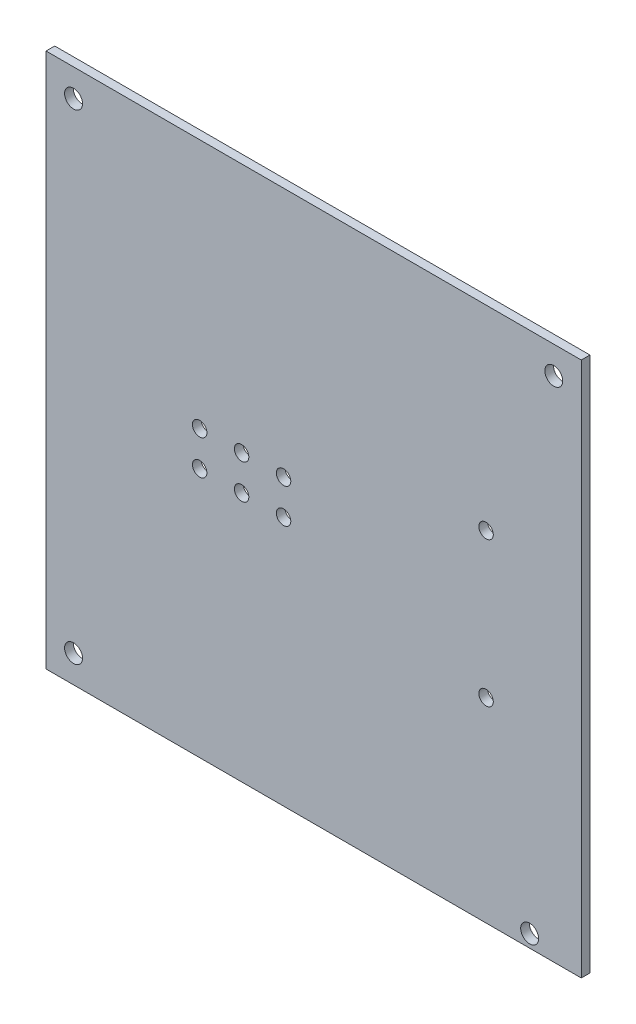
ISO-10303-21;
HEADER;
FILE_DESCRIPTION(('STEP AP214'),'2;1');
FILE_NAME('part.step','',(''),(''),'','','');
FILE_SCHEMA(('AUTOMOTIVE_DESIGN { 1 0 10303 214 1 1 1 1 }'));
ENDSEC;
DATA;
#1=APPLICATION_CONTEXT('core data for automotive mechanical design processes');
#2=APPLICATION_PROTOCOL_DEFINITION('international standard','automotive_design',2000,#1);
#3=PRODUCT_CONTEXT('',#1,'mechanical');
#4=PRODUCT('Part','Part','',(#3));
#5=PRODUCT_RELATED_PRODUCT_CATEGORY('part','',(#4));
#6=PRODUCT_DEFINITION_FORMATION('','',#4);
#7=PRODUCT_DEFINITION_CONTEXT('part definition',#1,'design');
#8=PRODUCT_DEFINITION('design','',#6,#7);
#9=PRODUCT_DEFINITION_SHAPE('','',#8);
#10=(LENGTH_UNIT() NAMED_UNIT(*) SI_UNIT(.MILLI.,.METRE.));
#11=(NAMED_UNIT(*) PLANE_ANGLE_UNIT() SI_UNIT($,.RADIAN.));
#12=(NAMED_UNIT(*) SI_UNIT($,.STERADIAN.) SOLID_ANGLE_UNIT());
#13=UNCERTAINTY_MEASURE_WITH_UNIT(LENGTH_MEASURE(1.E-05),#10,'distance_accuracy_value','');
#14=(GEOMETRIC_REPRESENTATION_CONTEXT(3) GLOBAL_UNCERTAINTY_ASSIGNED_CONTEXT((#13)) GLOBAL_UNIT_ASSIGNED_CONTEXT((#10,
#11,#12)) REPRESENTATION_CONTEXT('',''));
#15=CARTESIAN_POINT('',(0.,0.,0.));
#16=DIRECTION('',(0.,0.,1.));
#17=DIRECTION('',(1.,0.,0.));
#18=AXIS2_PLACEMENT_3D('',#15,#16,#17);
#19=CARTESIAN_POINT('',(-46.25,-46.25,1.5));
#20=DIRECTION('',(1.,0.,0.));
#21=DIRECTION('',(0.,0.,-1.));
#22=AXIS2_PLACEMENT_3D('',#19,#20,#21);
#23=PLANE('',#22);
#24=DIRECTION('',(0.,-1.,0.));
#25=VECTOR('',#24,1.);
#26=CARTESIAN_POINT('',(-46.25,-46.25,0.));
#27=LINE('',#26,#25);
#28=CARTESIAN_POINT('',(-46.25,46.25,0.));
#29=VERTEX_POINT('',#28);
#30=CARTESIAN_POINT('',(-46.25,-46.25,0.));
#31=VERTEX_POINT('',#30);
#32=EDGE_CURVE('E104',#29,#31,#27,.T.);
#33=ORIENTED_EDGE('',*,*,#32,.T.);
#34=DIRECTION('',(0.,0.,-1.));
#35=VECTOR('',#34,1.);
#36=CARTESIAN_POINT('',(-46.25,-46.25,1.5));
#37=LINE('',#36,#35);
#38=CARTESIAN_POINT('',(-46.25,-46.25,1.5));
#39=VERTEX_POINT('',#38);
#40=EDGE_CURVE('E11',#39,#31,#37,.T.);
#41=ORIENTED_EDGE('',*,*,#40,.F.);
#42=DIRECTION('',(0.,-1.,0.));
#43=VECTOR('',#42,1.);
#44=CARTESIAN_POINT('',(-46.25,-46.25,1.5));
#45=LINE('',#44,#43);
#46=CARTESIAN_POINT('',(-46.25,46.25,1.5));
#47=VERTEX_POINT('',#46);
#48=EDGE_CURVE('E92',#47,#39,#45,.T.);
#49=ORIENTED_EDGE('',*,*,#48,.F.);
#50=DIRECTION('',(0.,0.,-1.));
#51=VECTOR('',#50,1.);
#52=CARTESIAN_POINT('',(-46.25,46.25,1.5));
#53=LINE('',#52,#51);
#54=EDGE_CURVE('E100',#47,#29,#53,.T.);
#55=ORIENTED_EDGE('',*,*,#54,.T.);
#56=EDGE_LOOP('',(#33,#41,#49,#55));
#57=FACE_BOUND('',#56,.T.);
#58=ADVANCED_FACE('F41',(#57),#23,.F.);
#59=CARTESIAN_POINT('',(46.25,-46.25,1.5));
#60=DIRECTION('',(0.,1.,0.));
#61=DIRECTION('',(-1.,0.,0.));
#62=AXIS2_PLACEMENT_3D('',#59,#60,#61);
#63=PLANE('',#62);
#64=DIRECTION('',(1.,0.,0.));
#65=VECTOR('',#64,1.);
#66=CARTESIAN_POINT('',(46.25,-46.25,0.));
#67=LINE('',#66,#65);
#68=CARTESIAN_POINT('',(46.25,-46.25,0.));
#69=VERTEX_POINT('',#68);
#70=EDGE_CURVE('E96',#31,#69,#67,.T.);
#71=ORIENTED_EDGE('',*,*,#70,.T.);
#72=DIRECTION('',(0.,0.,-1.));
#73=VECTOR('',#72,1.);
#74=CARTESIAN_POINT('',(46.25,-46.25,1.5));
#75=LINE('',#74,#73);
#76=CARTESIAN_POINT('',(46.25,-46.25,1.5));
#77=VERTEX_POINT('',#76);
#78=EDGE_CURVE('E49',#77,#69,#75,.T.);
#79=ORIENTED_EDGE('',*,*,#78,.F.);
#80=DIRECTION('',(1.,0.,0.));
#81=VECTOR('',#80,1.);
#82=CARTESIAN_POINT('',(46.25,-46.25,1.5));
#83=LINE('',#82,#81);
#84=EDGE_CURVE('E87',#39,#77,#83,.T.);
#85=ORIENTED_EDGE('',*,*,#84,.F.);
#86=ORIENTED_EDGE('',*,*,#40,.T.);
#87=EDGE_LOOP('',(#71,#79,#85,#86));
#88=FACE_BOUND('',#87,.T.);
#89=ADVANCED_FACE('F95',(#88),#63,.F.);
#90=CARTESIAN_POINT('',(46.25,-46.25,1.5));
#91=DIRECTION('',(-1.,0.,0.));
#92=DIRECTION('',(0.,0.,1.));
#93=AXIS2_PLACEMENT_3D('',#90,#91,#92);
#94=PLANE('',#93);
#95=DIRECTION('',(0.,1.,0.));
#96=VECTOR('',#95,1.);
#97=CARTESIAN_POINT('',(46.25,-46.25,0.));
#98=LINE('',#97,#96);
#99=CARTESIAN_POINT('',(46.25,46.25,0.));
#100=VERTEX_POINT('',#99);
#101=EDGE_CURVE('E74',#69,#100,#98,.T.);
#102=ORIENTED_EDGE('',*,*,#101,.T.);
#103=DIRECTION('',(0.,0.,-1.));
#104=VECTOR('',#103,1.);
#105=CARTESIAN_POINT('',(46.25,46.25,1.5));
#106=LINE('',#105,#104);
#107=CARTESIAN_POINT('',(46.25,46.25,1.5));
#108=VERTEX_POINT('',#107);
#109=EDGE_CURVE('E97',#108,#100,#106,.T.);
#110=ORIENTED_EDGE('',*,*,#109,.F.);
#111=DIRECTION('',(0.,1.,0.));
#112=VECTOR('',#111,1.);
#113=CARTESIAN_POINT('',(46.25,-46.25,1.5));
#114=LINE('',#113,#112);
#115=EDGE_CURVE('E90',#77,#108,#114,.T.);
#116=ORIENTED_EDGE('',*,*,#115,.F.);
#117=ORIENTED_EDGE('',*,*,#78,.T.);
#118=EDGE_LOOP('',(#102,#110,#116,#117));
#119=FACE_BOUND('',#118,.T.);
#120=ADVANCED_FACE('F98',(#119),#94,.F.);
#121=CARTESIAN_POINT('',(46.25,46.25,1.5));
#122=DIRECTION('',(0.,-1.,0.));
#123=DIRECTION('',(1.,0.,0.));
#124=AXIS2_PLACEMENT_3D('',#121,#122,#123);
#125=PLANE('',#124);
#126=DIRECTION('',(-1.,0.,0.));
#127=VECTOR('',#126,1.);
#128=CARTESIAN_POINT('',(46.25,46.25,0.));
#129=LINE('',#128,#127);
#130=EDGE_CURVE('E80',#100,#29,#129,.T.);
#131=ORIENTED_EDGE('',*,*,#130,.T.);
#132=ORIENTED_EDGE('',*,*,#54,.F.);
#133=DIRECTION('',(-1.,0.,0.));
#134=VECTOR('',#133,1.);
#135=CARTESIAN_POINT('',(46.25,46.25,1.5));
#136=LINE('',#135,#134);
#137=EDGE_CURVE('E57',#108,#47,#136,.T.);
#138=ORIENTED_EDGE('',*,*,#137,.F.);
#139=ORIENTED_EDGE('',*,*,#109,.T.);
#140=EDGE_LOOP('',(#131,#132,#138,#139));
#141=FACE_BOUND('',#140,.T.);
#142=ADVANCED_FACE('F112',(#141),#125,.F.);
#143=CARTESIAN_POINT('',(0.,0.,1.5));
#144=DIRECTION('',(0.,0.,1.));
#145=DIRECTION('',(1.,0.,0.));
#146=AXIS2_PLACEMENT_3D('',#143,#144,#145);
#147=PLANE('',#146);
#148=CARTESIAN_POINT('',(-19.7049759550091,3.00000000013522,1.5));
#149=DIRECTION('',(0.,0.,-1.));
#150=DIRECTION('',(-1.,0.,0.));
#151=AXIS2_PLACEMENT_3D('',#148,#149,#150);
#152=CIRCLE('',#151,1.25);
#153=CARTESIAN_POINT('',(-20.9549759550091,3.00000000013522,1.5));
#154=VERTEX_POINT('',#153);
#155=EDGE_CURVE('E183',#154,#154,#152,.T.);
#156=ORIENTED_EDGE('',*,*,#155,.T.);
#157=EDGE_LOOP('',(#156));
#158=FACE_BOUND('',#157,.T.);
#159=CARTESIAN_POINT('',(-19.7049759550134,-2.99999999986479,1.5));
#160=DIRECTION('',(0.,0.,-1.));
#161=DIRECTION('',(-1.,0.,0.));
#162=AXIS2_PLACEMENT_3D('',#159,#160,#161);
#163=CIRCLE('',#162,1.25);
#164=CARTESIAN_POINT('',(-20.9549759550134,-2.99999999986479,1.5));
#165=VERTEX_POINT('',#164);
#166=EDGE_CURVE('E177',#165,#165,#163,.T.);
#167=ORIENTED_EDGE('',*,*,#166,.T.);
#168=EDGE_LOOP('',(#167));
#169=FACE_BOUND('',#168,.T.);
#170=CARTESIAN_POINT('',(-12.4549759550134,-2.99999999987001,1.5));
#171=DIRECTION('',(0.,0.,-1.));
#172=DIRECTION('',(-1.,0.,0.));
#173=AXIS2_PLACEMENT_3D('',#170,#171,#172);
#174=CIRCLE('',#173,1.25);
#175=CARTESIAN_POINT('',(-13.7049759550134,-2.99999999987001,1.5));
#176=VERTEX_POINT('',#175);
#177=EDGE_CURVE('E171',#176,#176,#174,.T.);
#178=ORIENTED_EDGE('',*,*,#177,.T.);
#179=EDGE_LOOP('',(#178));
#180=FACE_BOUND('',#179,.T.);
#181=CARTESIAN_POINT('',(-12.4549759550091,3.00000000013,1.5));
#182=DIRECTION('',(0.,0.,-1.));
#183=DIRECTION('',(-1.,0.,0.));
#184=AXIS2_PLACEMENT_3D('',#181,#182,#183);
#185=CIRCLE('',#184,1.25);
#186=CARTESIAN_POINT('',(-13.7049759550091,3.00000000013,1.5));
#187=VERTEX_POINT('',#186);
#188=EDGE_CURVE('E165',#187,#187,#185,.T.);
#189=ORIENTED_EDGE('',*,*,#188,.T.);
#190=EDGE_LOOP('',(#189));
#191=FACE_BOUND('',#190,.T.);
#192=CARTESIAN_POINT('',(-5.20497595500907,3.00000000012478,1.5));
#193=DIRECTION('',(0.,0.,-1.));
#194=DIRECTION('',(-1.,0.,0.));
#195=AXIS2_PLACEMENT_3D('',#192,#193,#194);
#196=CIRCLE('',#195,1.25);
#197=CARTESIAN_POINT('',(-6.45497595500907,3.00000000012478,1.5));
#198=VERTEX_POINT('',#197);
#199=EDGE_CURVE('E159',#198,#198,#196,.T.);
#200=ORIENTED_EDGE('',*,*,#199,.T.);
#201=EDGE_LOOP('',(#200));
#202=FACE_BOUND('',#201,.T.);
#203=CARTESIAN_POINT('',(-5.2049759550134,-2.99999999987523,1.5));
#204=DIRECTION('',(0.,0.,-1.));
#205=DIRECTION('',(-1.,0.,0.));
#206=AXIS2_PLACEMENT_3D('',#203,#204,#205);
#207=CIRCLE('',#206,1.25);
#208=CARTESIAN_POINT('',(-6.4549759550134,-2.99999999987523,1.5));
#209=VERTEX_POINT('',#208);
#210=EDGE_CURVE('E153',#209,#209,#207,.T.);
#211=ORIENTED_EDGE('',*,*,#210,.T.);
#212=EDGE_LOOP('',(#211));
#213=FACE_BOUND('',#212,.T.);
#214=CARTESIAN_POINT('',(29.795024044932,12.5020147484995,1.5));
#215=DIRECTION('',(0.,0.,-1.));
#216=DIRECTION('',(-1.,0.,0.));
#217=AXIS2_PLACEMENT_3D('',#214,#215,#216);
#218=CIRCLE('',#217,1.25);
#219=CARTESIAN_POINT('',(28.545024044932,12.5020147484995,1.5));
#220=VERTEX_POINT('',#219);
#221=EDGE_CURVE('E147',#220,#220,#218,.T.);
#222=ORIENTED_EDGE('',*,*,#221,.T.);
#223=EDGE_LOOP('',(#222));
#224=FACE_BOUND('',#223,.T.);
#225=CARTESIAN_POINT('',(29.795024044914,-12.50177791102,1.5));
#226=DIRECTION('',(0.,0.,-1.));
#227=DIRECTION('',(-1.,0.,0.));
#228=AXIS2_PLACEMENT_3D('',#225,#226,#227);
#229=CIRCLE('',#228,1.25);
#230=CARTESIAN_POINT('',(28.545024044914,-12.50177791102,1.5));
#231=VERTEX_POINT('',#230);
#232=EDGE_CURVE('E141',#231,#231,#229,.T.);
#233=ORIENTED_EDGE('',*,*,#232,.T.);
#234=EDGE_LOOP('',(#233));
#235=FACE_BOUND('',#234,.T.);
#236=CARTESIAN_POINT('',(-41.4999999999924,41.500000000232,1.5));
#237=DIRECTION('',(0.,0.,1.));
#238=DIRECTION('',(1.,0.,0.));
#239=AXIS2_PLACEMENT_3D('',#236,#237,#238);
#240=CIRCLE('',#239,1.54999999999999);
#241=CARTESIAN_POINT('',(-39.9499999999924,41.500000000232,1.5));
#242=VERTEX_POINT('',#241);
#243=EDGE_CURVE('E138',#242,#242,#240,.T.);
#244=ORIENTED_EDGE('',*,*,#243,.F.);
#245=EDGE_LOOP('',(#244));
#246=FACE_BOUND('',#245,.T.);
#247=CARTESIAN_POINT('',(41.5000000000076,41.5000000001722,1.5));
#248=DIRECTION('',(0.,0.,1.));
#249=DIRECTION('',(1.,0.,0.));
#250=AXIS2_PLACEMENT_3D('',#247,#248,#249);
#251=CIRCLE('',#250,1.54999999999999);
#252=CARTESIAN_POINT('',(43.0500000000076,41.5000000001722,1.5));
#253=VERTEX_POINT('',#252);
#254=EDGE_CURVE('E132',#253,#253,#251,.T.);
#255=ORIENTED_EDGE('',*,*,#254,.F.);
#256=EDGE_LOOP('',(#255));
#257=FACE_BOUND('',#256,.T.);
#258=CARTESIAN_POINT('',(37.3299999999459,-44.0499999998248,1.5));
#259=DIRECTION('',(0.,0.,1.));
#260=DIRECTION('',(1.,0.,0.));
#261=AXIS2_PLACEMENT_3D('',#258,#259,#260);
#262=CIRCLE('',#261,1.54999999999999);
#263=CARTESIAN_POINT('',(38.8799999999459,-44.0499999998248,1.5));
#264=VERTEX_POINT('',#263);
#265=EDGE_CURVE('E126',#264,#264,#262,.T.);
#266=ORIENTED_EDGE('',*,*,#265,.F.);
#267=EDGE_LOOP('',(#266));
#268=FACE_BOUND('',#267,.T.);
#269=CARTESIAN_POINT('',(-41.5000000000522,-41.499999999768,1.5));
#270=DIRECTION('',(0.,0.,1.));
#271=DIRECTION('',(1.,0.,0.));
#272=AXIS2_PLACEMENT_3D('',#269,#270,#271);
#273=CIRCLE('',#272,1.54999999999999);
#274=CARTESIAN_POINT('',(-39.9500000000523,-41.499999999768,1.5));
#275=VERTEX_POINT('',#274);
#276=EDGE_CURVE('E120',#275,#275,#273,.T.);
#277=ORIENTED_EDGE('',*,*,#276,.F.);
#278=EDGE_LOOP('',(#277));
#279=FACE_BOUND('',#278,.T.);
#280=ORIENTED_EDGE('',*,*,#48,.T.);
#281=ORIENTED_EDGE('',*,*,#84,.T.);
#282=ORIENTED_EDGE('',*,*,#115,.T.);
#283=ORIENTED_EDGE('',*,*,#137,.T.);
#284=EDGE_LOOP('',(#280,#281,#282,#283));
#285=FACE_BOUND('',#284,.T.);
#286=ADVANCED_FACE('F88',(#158,#169,#180,#191,#202,#213,#224,#235,#246,#257,#268,#279,#285),
#147,.T.);
#287=CARTESIAN_POINT('',(0.,0.,0.));
#288=DIRECTION('',(0.,0.,1.));
#289=DIRECTION('',(1.,0.,0.));
#290=AXIS2_PLACEMENT_3D('',#287,#288,#289);
#291=PLANE('',#290);
#292=CARTESIAN_POINT('',(-19.7049759550091,3.00000000013522,0.));
#293=DIRECTION('',(0.,0.,-1.));
#294=DIRECTION('',(-1.,0.,0.));
#295=AXIS2_PLACEMENT_3D('',#292,#293,#294);
#296=CIRCLE('',#295,1.24999999999999);
#297=CARTESIAN_POINT('',(-20.9549759550091,3.00000000013522,0.));
#298=VERTEX_POINT('',#297);
#299=EDGE_CURVE('E186',#298,#298,#296,.T.);
#300=ORIENTED_EDGE('',*,*,#299,.F.);
#301=EDGE_LOOP('',(#300));
#302=FACE_BOUND('',#301,.T.);
#303=CARTESIAN_POINT('',(-19.7049759550134,-2.99999999986479,0.));
#304=DIRECTION('',(0.,0.,-1.));
#305=DIRECTION('',(-1.,0.,0.));
#306=AXIS2_PLACEMENT_3D('',#303,#304,#305);
#307=CIRCLE('',#306,1.24999999999999);
#308=CARTESIAN_POINT('',(-20.9549759550134,-2.99999999986479,0.));
#309=VERTEX_POINT('',#308);
#310=EDGE_CURVE('E180',#309,#309,#307,.T.);
#311=ORIENTED_EDGE('',*,*,#310,.F.);
#312=EDGE_LOOP('',(#311));
#313=FACE_BOUND('',#312,.T.);
#314=CARTESIAN_POINT('',(-12.4549759550134,-2.99999999987001,0.));
#315=DIRECTION('',(0.,0.,-1.));
#316=DIRECTION('',(-1.,0.,0.));
#317=AXIS2_PLACEMENT_3D('',#314,#315,#316);
#318=CIRCLE('',#317,1.24999999999999);
#319=CARTESIAN_POINT('',(-13.7049759550134,-2.99999999987001,0.));
#320=VERTEX_POINT('',#319);
#321=EDGE_CURVE('E174',#320,#320,#318,.T.);
#322=ORIENTED_EDGE('',*,*,#321,.F.);
#323=EDGE_LOOP('',(#322));
#324=FACE_BOUND('',#323,.T.);
#325=CARTESIAN_POINT('',(-12.4549759550091,3.00000000013,0.));
#326=DIRECTION('',(0.,0.,-1.));
#327=DIRECTION('',(-1.,0.,0.));
#328=AXIS2_PLACEMENT_3D('',#325,#326,#327);
#329=CIRCLE('',#328,1.24999999999999);
#330=CARTESIAN_POINT('',(-13.7049759550091,3.00000000013,0.));
#331=VERTEX_POINT('',#330);
#332=EDGE_CURVE('E168',#331,#331,#329,.T.);
#333=ORIENTED_EDGE('',*,*,#332,.F.);
#334=EDGE_LOOP('',(#333));
#335=FACE_BOUND('',#334,.T.);
#336=CARTESIAN_POINT('',(-5.20497595500907,3.00000000012478,0.));
#337=DIRECTION('',(0.,0.,-1.));
#338=DIRECTION('',(-1.,0.,0.));
#339=AXIS2_PLACEMENT_3D('',#336,#337,#338);
#340=CIRCLE('',#339,1.24999999999999);
#341=CARTESIAN_POINT('',(-6.45497595500906,3.00000000012478,0.));
#342=VERTEX_POINT('',#341);
#343=EDGE_CURVE('E162',#342,#342,#340,.T.);
#344=ORIENTED_EDGE('',*,*,#343,.F.);
#345=EDGE_LOOP('',(#344));
#346=FACE_BOUND('',#345,.T.);
#347=CARTESIAN_POINT('',(-5.2049759550134,-2.99999999987523,0.));
#348=DIRECTION('',(0.,0.,-1.));
#349=DIRECTION('',(-1.,0.,0.));
#350=AXIS2_PLACEMENT_3D('',#347,#348,#349);
#351=CIRCLE('',#350,1.24999999999999);
#352=CARTESIAN_POINT('',(-6.45497595501339,-2.99999999987523,0.));
#353=VERTEX_POINT('',#352);
#354=EDGE_CURVE('E156',#353,#353,#351,.T.);
#355=ORIENTED_EDGE('',*,*,#354,.F.);
#356=EDGE_LOOP('',(#355));
#357=FACE_BOUND('',#356,.T.);
#358=CARTESIAN_POINT('',(29.795024044932,12.5020147484995,0.));
#359=DIRECTION('',(0.,0.,-1.));
#360=DIRECTION('',(-1.,0.,0.));
#361=AXIS2_PLACEMENT_3D('',#358,#359,#360);
#362=CIRCLE('',#361,1.24999999999999);
#363=CARTESIAN_POINT('',(28.545024044932,12.5020147484995,0.));
#364=VERTEX_POINT('',#363);
#365=EDGE_CURVE('E150',#364,#364,#362,.T.);
#366=ORIENTED_EDGE('',*,*,#365,.F.);
#367=EDGE_LOOP('',(#366));
#368=FACE_BOUND('',#367,.T.);
#369=CARTESIAN_POINT('',(29.795024044914,-12.50177791102,0.));
#370=DIRECTION('',(0.,0.,-1.));
#371=DIRECTION('',(-1.,0.,0.));
#372=AXIS2_PLACEMENT_3D('',#369,#370,#371);
#373=CIRCLE('',#372,1.24999999999999);
#374=CARTESIAN_POINT('',(28.545024044914,-12.50177791102,0.));
#375=VERTEX_POINT('',#374);
#376=EDGE_CURVE('E144',#375,#375,#373,.T.);
#377=ORIENTED_EDGE('',*,*,#376,.F.);
#378=EDGE_LOOP('',(#377));
#379=FACE_BOUND('',#378,.T.);
#380=CARTESIAN_POINT('',(-41.4999999999924,41.500000000232,0.));
#381=DIRECTION('',(0.,0.,1.));
#382=DIRECTION('',(1.,0.,0.));
#383=AXIS2_PLACEMENT_3D('',#380,#381,#382);
#384=CIRCLE('',#383,1.55);
#385=CARTESIAN_POINT('',(-39.9499999999924,41.500000000232,0.));
#386=VERTEX_POINT('',#385);
#387=EDGE_CURVE('E135',#386,#386,#384,.T.);
#388=ORIENTED_EDGE('',*,*,#387,.T.);
#389=EDGE_LOOP('',(#388));
#390=FACE_BOUND('',#389,.T.);
#391=CARTESIAN_POINT('',(41.5000000000076,41.5000000001722,0.));
#392=DIRECTION('',(0.,0.,1.));
#393=DIRECTION('',(1.,0.,0.));
#394=AXIS2_PLACEMENT_3D('',#391,#392,#393);
#395=CIRCLE('',#394,1.55);
#396=CARTESIAN_POINT('',(43.0500000000076,41.5000000001722,0.));
#397=VERTEX_POINT('',#396);
#398=EDGE_CURVE('E129',#397,#397,#395,.T.);
#399=ORIENTED_EDGE('',*,*,#398,.T.);
#400=EDGE_LOOP('',(#399));
#401=FACE_BOUND('',#400,.T.);
#402=CARTESIAN_POINT('',(37.3299999999459,-44.0499999998248,0.));
#403=DIRECTION('',(0.,0.,1.));
#404=DIRECTION('',(1.,0.,0.));
#405=AXIS2_PLACEMENT_3D('',#402,#403,#404);
#406=CIRCLE('',#405,1.55);
#407=CARTESIAN_POINT('',(38.8799999999459,-44.0499999998248,0.));
#408=VERTEX_POINT('',#407);
#409=EDGE_CURVE('E123',#408,#408,#406,.T.);
#410=ORIENTED_EDGE('',*,*,#409,.T.);
#411=EDGE_LOOP('',(#410));
#412=FACE_BOUND('',#411,.T.);
#413=CARTESIAN_POINT('',(-41.5000000000522,-41.499999999768,0.));
#414=DIRECTION('',(0.,0.,1.));
#415=DIRECTION('',(1.,0.,0.));
#416=AXIS2_PLACEMENT_3D('',#413,#414,#415);
#417=CIRCLE('',#416,1.55);
#418=CARTESIAN_POINT('',(-39.9500000000522,-41.499999999768,0.));
#419=VERTEX_POINT('',#418);
#420=EDGE_CURVE('E107',#419,#419,#417,.T.);
#421=ORIENTED_EDGE('',*,*,#420,.T.);
#422=EDGE_LOOP('',(#421));
#423=FACE_BOUND('',#422,.T.);
#424=ORIENTED_EDGE('',*,*,#32,.F.);
#425=ORIENTED_EDGE('',*,*,#130,.F.);
#426=ORIENTED_EDGE('',*,*,#101,.F.);
#427=ORIENTED_EDGE('',*,*,#70,.F.);
#428=EDGE_LOOP('',(#424,#425,#426,#427));
#429=FACE_BOUND('',#428,.T.);
#430=ADVANCED_FACE('F115',(#302,#313,#324,#335,#346,#357,#368,#379,#390,#401,#412,#423,#429),
#291,.F.);
#431=CARTESIAN_POINT('',(-41.5000000000522,-41.499999999768,1.5));
#432=DIRECTION('',(0.,0.,1.));
#433=DIRECTION('',(1.,0.,0.));
#434=AXIS2_PLACEMENT_3D('',#431,#432,#433);
#435=CYLINDRICAL_SURFACE('',#434,1.54999999999999);
#436=ORIENTED_EDGE('',*,*,#420,.F.);
#437=EDGE_LOOP('',(#436));
#438=FACE_BOUND('',#437,.T.);
#439=ORIENTED_EDGE('',*,*,#276,.T.);
#440=EDGE_LOOP('',(#439));
#441=FACE_BOUND('',#440,.T.);
#442=ADVANCED_FACE('F194',(#438,#441),#435,.F.);
#443=CARTESIAN_POINT('',(37.3299999999459,-44.0499999998248,1.5));
#444=DIRECTION('',(0.,0.,1.));
#445=DIRECTION('',(1.,0.,0.));
#446=AXIS2_PLACEMENT_3D('',#443,#444,#445);
#447=CYLINDRICAL_SURFACE('',#446,1.54999999999999);
#448=ORIENTED_EDGE('',*,*,#409,.F.);
#449=EDGE_LOOP('',(#448));
#450=FACE_BOUND('',#449,.T.);
#451=ORIENTED_EDGE('',*,*,#265,.T.);
#452=EDGE_LOOP('',(#451));
#453=FACE_BOUND('',#452,.T.);
#454=ADVANCED_FACE('F220',(#450,#453),#447,.F.);
#455=CARTESIAN_POINT('',(41.5000000000076,41.5000000001722,1.5));
#456=DIRECTION('',(0.,0.,1.));
#457=DIRECTION('',(1.,0.,0.));
#458=AXIS2_PLACEMENT_3D('',#455,#456,#457);
#459=CYLINDRICAL_SURFACE('',#458,1.54999999999999);
#460=ORIENTED_EDGE('',*,*,#398,.F.);
#461=EDGE_LOOP('',(#460));
#462=FACE_BOUND('',#461,.T.);
#463=ORIENTED_EDGE('',*,*,#254,.T.);
#464=EDGE_LOOP('',(#463));
#465=FACE_BOUND('',#464,.T.);
#466=ADVANCED_FACE('F268',(#462,#465),#459,.F.);
#467=CARTESIAN_POINT('',(-41.4999999999924,41.500000000232,1.5));
#468=DIRECTION('',(0.,0.,1.));
#469=DIRECTION('',(1.,0.,0.));
#470=AXIS2_PLACEMENT_3D('',#467,#468,#469);
#471=CYLINDRICAL_SURFACE('',#470,1.54999999999999);
#472=ORIENTED_EDGE('',*,*,#387,.F.);
#473=EDGE_LOOP('',(#472));
#474=FACE_BOUND('',#473,.T.);
#475=ORIENTED_EDGE('',*,*,#243,.T.);
#476=EDGE_LOOP('',(#475));
#477=FACE_BOUND('',#476,.T.);
#478=ADVANCED_FACE('F276',(#474,#477),#471,.F.);
#479=CARTESIAN_POINT('',(29.795024044914,-12.50177791102,0.));
#480=DIRECTION('',(0.,0.,-1.));
#481=DIRECTION('',(-1.,0.,0.));
#482=AXIS2_PLACEMENT_3D('',#479,#480,#481);
#483=CYLINDRICAL_SURFACE('',#482,1.24999999999999);
#484=ORIENTED_EDGE('',*,*,#232,.F.);
#485=EDGE_LOOP('',(#484));
#486=FACE_BOUND('',#485,.T.);
#487=ORIENTED_EDGE('',*,*,#376,.T.);
#488=EDGE_LOOP('',(#487));
#489=FACE_BOUND('',#488,.T.);
#490=ADVANCED_FACE('F283',(#486,#489),#483,.F.);
#491=CARTESIAN_POINT('',(29.795024044932,12.5020147484995,0.));
#492=DIRECTION('',(0.,0.,-1.));
#493=DIRECTION('',(-1.,0.,0.));
#494=AXIS2_PLACEMENT_3D('',#491,#492,#493);
#495=CYLINDRICAL_SURFACE('',#494,1.24999999999999);
#496=ORIENTED_EDGE('',*,*,#221,.F.);
#497=EDGE_LOOP('',(#496));
#498=FACE_BOUND('',#497,.T.);
#499=ORIENTED_EDGE('',*,*,#365,.T.);
#500=EDGE_LOOP('',(#499));
#501=FACE_BOUND('',#500,.T.);
#502=ADVANCED_FACE('F290',(#498,#501),#495,.F.);
#503=CARTESIAN_POINT('',(-5.2049759550134,-2.99999999987523,0.));
#504=DIRECTION('',(0.,0.,-1.));
#505=DIRECTION('',(-1.,0.,0.));
#506=AXIS2_PLACEMENT_3D('',#503,#504,#505);
#507=CYLINDRICAL_SURFACE('',#506,1.24999999999999);
#508=ORIENTED_EDGE('',*,*,#210,.F.);
#509=EDGE_LOOP('',(#508));
#510=FACE_BOUND('',#509,.T.);
#511=ORIENTED_EDGE('',*,*,#354,.T.);
#512=EDGE_LOOP('',(#511));
#513=FACE_BOUND('',#512,.T.);
#514=ADVANCED_FACE('F298',(#510,#513),#507,.F.);
#515=CARTESIAN_POINT('',(-5.20497595500907,3.00000000012478,0.));
#516=DIRECTION('',(0.,0.,-1.));
#517=DIRECTION('',(-1.,0.,0.));
#518=AXIS2_PLACEMENT_3D('',#515,#516,#517);
#519=CYLINDRICAL_SURFACE('',#518,1.24999999999999);
#520=ORIENTED_EDGE('',*,*,#199,.F.);
#521=EDGE_LOOP('',(#520));
#522=FACE_BOUND('',#521,.T.);
#523=ORIENTED_EDGE('',*,*,#343,.T.);
#524=EDGE_LOOP('',(#523));
#525=FACE_BOUND('',#524,.T.);
#526=ADVANCED_FACE('F306',(#522,#525),#519,.F.);
#527=CARTESIAN_POINT('',(-12.4549759550091,3.00000000013,0.));
#528=DIRECTION('',(0.,0.,-1.));
#529=DIRECTION('',(-1.,0.,0.));
#530=AXIS2_PLACEMENT_3D('',#527,#528,#529);
#531=CYLINDRICAL_SURFACE('',#530,1.24999999999999);
#532=ORIENTED_EDGE('',*,*,#188,.F.);
#533=EDGE_LOOP('',(#532));
#534=FACE_BOUND('',#533,.T.);
#535=ORIENTED_EDGE('',*,*,#332,.T.);
#536=EDGE_LOOP('',(#535));
#537=FACE_BOUND('',#536,.T.);
#538=ADVANCED_FACE('F314',(#534,#537),#531,.F.);
#539=CARTESIAN_POINT('',(-12.4549759550134,-2.99999999987001,0.));
#540=DIRECTION('',(0.,0.,-1.));
#541=DIRECTION('',(-1.,0.,0.));
#542=AXIS2_PLACEMENT_3D('',#539,#540,#541);
#543=CYLINDRICAL_SURFACE('',#542,1.24999999999999);
#544=ORIENTED_EDGE('',*,*,#177,.F.);
#545=EDGE_LOOP('',(#544));
#546=FACE_BOUND('',#545,.T.);
#547=ORIENTED_EDGE('',*,*,#321,.T.);
#548=EDGE_LOOP('',(#547));
#549=FACE_BOUND('',#548,.T.);
#550=ADVANCED_FACE('F322',(#546,#549),#543,.F.);
#551=CARTESIAN_POINT('',(-19.7049759550134,-2.99999999986479,0.));
#552=DIRECTION('',(0.,0.,-1.));
#553=DIRECTION('',(-1.,0.,0.));
#554=AXIS2_PLACEMENT_3D('',#551,#552,#553);
#555=CYLINDRICAL_SURFACE('',#554,1.24999999999999);
#556=ORIENTED_EDGE('',*,*,#166,.F.);
#557=EDGE_LOOP('',(#556));
#558=FACE_BOUND('',#557,.T.);
#559=ORIENTED_EDGE('',*,*,#310,.T.);
#560=EDGE_LOOP('',(#559));
#561=FACE_BOUND('',#560,.T.);
#562=ADVANCED_FACE('F330',(#558,#561),#555,.F.);
#563=CARTESIAN_POINT('',(-19.7049759550091,3.00000000013522,0.));
#564=DIRECTION('',(0.,0.,-1.));
#565=DIRECTION('',(-1.,0.,0.));
#566=AXIS2_PLACEMENT_3D('',#563,#564,#565);
#567=CYLINDRICAL_SURFACE('',#566,1.24999999999999);
#568=ORIENTED_EDGE('',*,*,#155,.F.);
#569=EDGE_LOOP('',(#568));
#570=FACE_BOUND('',#569,.T.);
#571=ORIENTED_EDGE('',*,*,#299,.T.);
#572=EDGE_LOOP('',(#571));
#573=FACE_BOUND('',#572,.T.);
#574=ADVANCED_FACE('F190',(#570,#573),#567,.F.);
#575=CLOSED_SHELL('',(#58,#89,#120,#142,#286,#430,#442,#454,#466,#478,#490,#502,#514,#526,#538,
#550,#562,#574));
#576=MANIFOLD_SOLID_BREP('B2',#575);
#577=ADVANCED_BREP_SHAPE_REPRESENTATION('',(#18,#576),#14);
#578=SHAPE_DEFINITION_REPRESENTATION(#9,#577);
ENDSEC;
END-ISO-10303-21;
